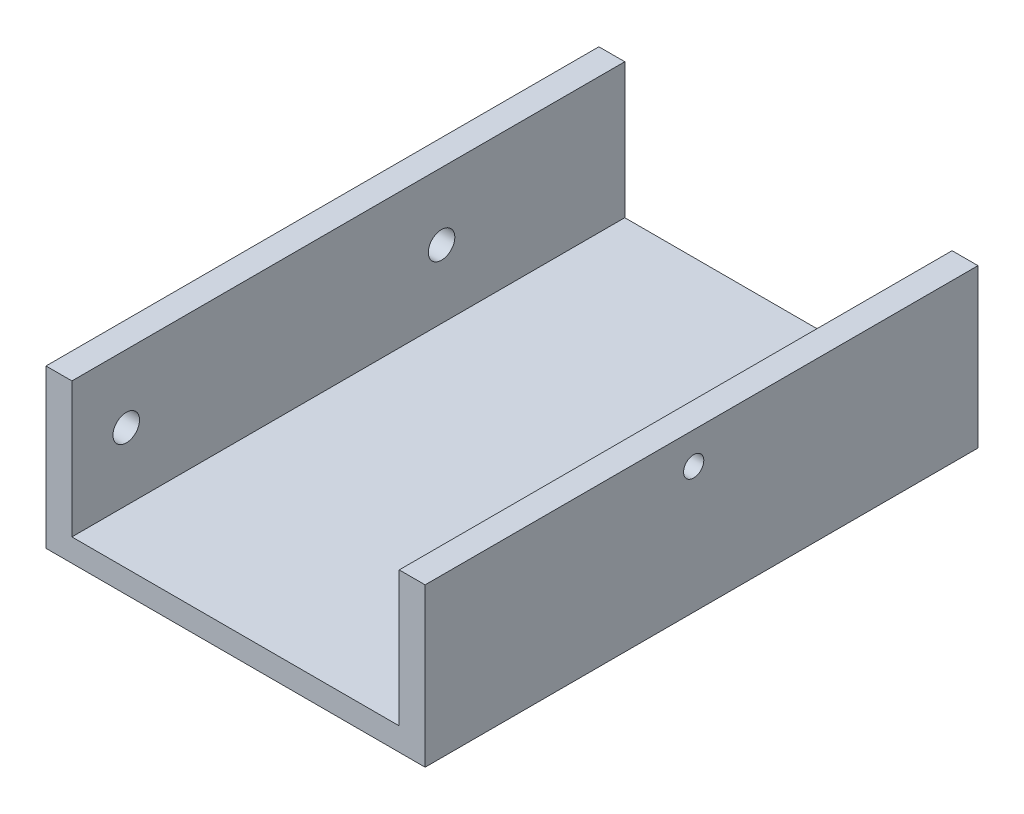
ISO-10303-21;
HEADER;
FILE_DESCRIPTION(('STEP AP214'),'2;1');
FILE_NAME('part.step','',(''),(''),'','','');
FILE_SCHEMA(('AUTOMOTIVE_DESIGN { 1 0 10303 214 1 1 1 1 }'));
ENDSEC;
DATA;
#1=APPLICATION_CONTEXT('core data for automotive mechanical design processes');
#2=APPLICATION_PROTOCOL_DEFINITION('international standard','automotive_design',2000,#1);
#3=PRODUCT_CONTEXT('',#1,'mechanical');
#4=PRODUCT('Part','Part','',(#3));
#5=PRODUCT_RELATED_PRODUCT_CATEGORY('part','',(#4));
#6=PRODUCT_DEFINITION_FORMATION('','',#4);
#7=PRODUCT_DEFINITION_CONTEXT('part definition',#1,'design');
#8=PRODUCT_DEFINITION('design','',#6,#7);
#9=PRODUCT_DEFINITION_SHAPE('','',#8);
#10=(LENGTH_UNIT() NAMED_UNIT(*) SI_UNIT(.MILLI.,.METRE.));
#11=(NAMED_UNIT(*) PLANE_ANGLE_UNIT() SI_UNIT($,.RADIAN.));
#12=(NAMED_UNIT(*) SI_UNIT($,.STERADIAN.) SOLID_ANGLE_UNIT());
#13=UNCERTAINTY_MEASURE_WITH_UNIT(LENGTH_MEASURE(1.E-05),#10,'distance_accuracy_value','');
#14=(GEOMETRIC_REPRESENTATION_CONTEXT(3) GLOBAL_UNCERTAINTY_ASSIGNED_CONTEXT((#13)) GLOBAL_UNIT_ASSIGNED_CONTEXT((#10,
#11,#12)) REPRESENTATION_CONTEXT('',''));
#15=CARTESIAN_POINT('',(0.,0.,0.));
#16=DIRECTION('',(0.,0.,1.));
#17=DIRECTION('',(1.,0.,0.));
#18=AXIS2_PLACEMENT_3D('',#15,#16,#17);
#19=CARTESIAN_POINT('',(-38.1,0.,111.125));
#20=DIRECTION('',(1.,0.,0.));
#21=DIRECTION('',(0.,0.,-1.));
#22=AXIS2_PLACEMENT_3D('',#19,#20,#21);
#23=PLANE('',#22);
#24=CARTESIAN_POINT('',(-38.1,18.1633908346726,100.203));
#25=DIRECTION('',(1.,0.,0.));
#26=DIRECTION('',(0.,0.,-1.));
#27=AXIS2_PLACEMENT_3D('',#24,#25,#26);
#28=CIRCLE('',#27,2.667);
#29=CARTESIAN_POINT('',(-38.1,18.1633908346726,97.536));
#30=VERTEX_POINT('',#29);
#31=EDGE_CURVE('E181',#30,#30,#28,.T.);
#32=ORIENTED_EDGE('',*,*,#31,.T.);
#33=EDGE_LOOP('',(#32));
#34=FACE_BOUND('',#33,.T.);
#35=CARTESIAN_POINT('',(-38.1,18.288,36.83));
#36=DIRECTION('',(1.,0.,0.));
#37=DIRECTION('',(0.,0.,-1.));
#38=AXIS2_PLACEMENT_3D('',#35,#36,#37);
#39=CIRCLE('',#38,2.667);
#40=CARTESIAN_POINT('',(-38.1,18.288,34.163));
#41=VERTEX_POINT('',#40);
#42=EDGE_CURVE('E134',#41,#41,#39,.T.);
#43=ORIENTED_EDGE('',*,*,#42,.T.);
#44=EDGE_LOOP('',(#43));
#45=FACE_BOUND('',#44,.T.);
#46=DIRECTION('',(0.,-1.,0.));
#47=VECTOR('',#46,1.);
#48=CARTESIAN_POINT('',(-38.1,0.,0.));
#49=LINE('',#48,#47);
#50=CARTESIAN_POINT('',(-38.1,31.75,0.));
#51=VERTEX_POINT('',#50);
#52=CARTESIAN_POINT('',(-38.1,0.,0.));
#53=VERTEX_POINT('',#52);
#54=EDGE_CURVE('E130',#51,#53,#49,.T.);
#55=ORIENTED_EDGE('',*,*,#54,.T.);
#56=DIRECTION('',(0.,0.,-1.));
#57=VECTOR('',#56,1.);
#58=CARTESIAN_POINT('',(-38.1,0.,111.125));
#59=LINE('',#58,#57);
#60=CARTESIAN_POINT('',(-38.1,0.,111.125));
#61=VERTEX_POINT('',#60);
#62=EDGE_CURVE('E11',#61,#53,#59,.T.);
#63=ORIENTED_EDGE('',*,*,#62,.F.);
#64=DIRECTION('',(0.,-1.,0.));
#65=VECTOR('',#64,1.);
#66=CARTESIAN_POINT('',(-38.1,0.,111.125));
#67=LINE('',#66,#65);
#68=CARTESIAN_POINT('',(-38.1,31.75,111.125));
#69=VERTEX_POINT('',#68);
#70=EDGE_CURVE('E145',#69,#61,#67,.T.);
#71=ORIENTED_EDGE('',*,*,#70,.F.);
#72=DIRECTION('',(0.,0.,-1.));
#73=VECTOR('',#72,1.);
#74=CARTESIAN_POINT('',(-38.1,31.75,111.125));
#75=LINE('',#74,#73);
#76=EDGE_CURVE('E126',#69,#51,#75,.T.);
#77=ORIENTED_EDGE('',*,*,#76,.T.);
#78=EDGE_LOOP('',(#55,#63,#71,#77));
#79=FACE_BOUND('',#78,.T.);
#80=ADVANCED_FACE('F34',(#34,#45,#79),#23,.F.);
#81=CARTESIAN_POINT('',(-38.1,0.,111.125));
#82=DIRECTION('',(0.,1.,0.));
#83=DIRECTION('',(-1.,0.,0.));
#84=AXIS2_PLACEMENT_3D('',#81,#82,#83);
#85=PLANE('',#84);
#86=DIRECTION('',(1.,0.,0.));
#87=VECTOR('',#86,1.);
#88=CARTESIAN_POINT('',(-38.1,0.,0.));
#89=LINE('',#88,#87);
#90=CARTESIAN_POINT('',(38.1,0.,0.));
#91=VERTEX_POINT('',#90);
#92=EDGE_CURVE('E133',#53,#91,#89,.T.);
#93=ORIENTED_EDGE('',*,*,#92,.T.);
#94=DIRECTION('',(0.,0.,-1.));
#95=VECTOR('',#94,1.);
#96=CARTESIAN_POINT('',(38.1,0.,111.125));
#97=LINE('',#96,#95);
#98=CARTESIAN_POINT('',(38.1,0.,111.125));
#99=VERTEX_POINT('',#98);
#100=EDGE_CURVE('E42',#99,#91,#97,.T.);
#101=ORIENTED_EDGE('',*,*,#100,.F.);
#102=DIRECTION('',(1.,0.,0.));
#103=VECTOR('',#102,1.);
#104=CARTESIAN_POINT('',(-38.1,0.,111.125));
#105=LINE('',#104,#103);
#106=EDGE_CURVE('E93',#61,#99,#105,.T.);
#107=ORIENTED_EDGE('',*,*,#106,.F.);
#108=ORIENTED_EDGE('',*,*,#62,.T.);
#109=EDGE_LOOP('',(#93,#101,#107,#108));
#110=FACE_BOUND('',#109,.T.);
#111=ADVANCED_FACE('F215',(#110),#85,.F.);
#112=CARTESIAN_POINT('',(38.1,31.75,111.125));
#113=DIRECTION('',(-1.,0.,0.));
#114=DIRECTION('',(0.,-1.,0.));
#115=AXIS2_PLACEMENT_3D('',#112,#113,#114);
#116=PLANE('',#115);
#117=CARTESIAN_POINT('',(38.1,25.4,57.15));
#118=DIRECTION('',(-1.,0.,0.));
#119=DIRECTION('',(0.,0.,1.));
#120=AXIS2_PLACEMENT_3D('',#117,#118,#119);
#121=CIRCLE('',#120,2.032);
#122=CARTESIAN_POINT('',(38.1,25.4,59.182));
#123=VERTEX_POINT('',#122);
#124=EDGE_CURVE('E187',#123,#123,#121,.T.);
#125=ORIENTED_EDGE('',*,*,#124,.T.);
#126=EDGE_LOOP('',(#125));
#127=FACE_BOUND('',#126,.T.);
#128=DIRECTION('',(0.,1.,0.));
#129=VECTOR('',#128,1.);
#130=CARTESIAN_POINT('',(38.1,31.75,0.));
#131=LINE('',#130,#129);
#132=CARTESIAN_POINT('',(38.1,31.75,0.));
#133=VERTEX_POINT('',#132);
#134=EDGE_CURVE('E136',#91,#133,#131,.T.);
#135=ORIENTED_EDGE('',*,*,#134,.T.);
#136=DIRECTION('',(0.,0.,-1.));
#137=VECTOR('',#136,1.);
#138=CARTESIAN_POINT('',(38.1,31.75,111.125));
#139=LINE('',#138,#137);
#140=CARTESIAN_POINT('',(38.1,31.75,111.125));
#141=VERTEX_POINT('',#140);
#142=EDGE_CURVE('E152',#141,#133,#139,.T.);
#143=ORIENTED_EDGE('',*,*,#142,.F.);
#144=DIRECTION('',(0.,1.,0.));
#145=VECTOR('',#144,1.);
#146=CARTESIAN_POINT('',(38.1,31.75,111.125));
#147=LINE('',#146,#145);
#148=EDGE_CURVE('E160',#99,#141,#147,.T.);
#149=ORIENTED_EDGE('',*,*,#148,.F.);
#150=ORIENTED_EDGE('',*,*,#100,.T.);
#151=EDGE_LOOP('',(#135,#143,#149,#150));
#152=FACE_BOUND('',#151,.T.);
#153=ADVANCED_FACE('F158',(#127,#152),#116,.F.);
#154=CARTESIAN_POINT('',(32.893,31.75,111.125));
#155=DIRECTION('',(0.,-1.,0.));
#156=DIRECTION('',(0.,0.,-1.));
#157=AXIS2_PLACEMENT_3D('',#154,#155,#156);
#158=PLANE('',#157);
#159=DIRECTION('',(-1.,0.,0.));
#160=VECTOR('',#159,1.);
#161=CARTESIAN_POINT('',(32.893,31.75,0.));
#162=LINE('',#161,#160);
#163=CARTESIAN_POINT('',(32.893,31.75,0.));
#164=VERTEX_POINT('',#163);
#165=EDGE_CURVE('E138',#133,#164,#162,.T.);
#166=ORIENTED_EDGE('',*,*,#165,.T.);
#167=DIRECTION('',(0.,0.,-1.));
#168=VECTOR('',#167,1.);
#169=CARTESIAN_POINT('',(32.893,31.75,111.125));
#170=LINE('',#169,#168);
#171=CARTESIAN_POINT('',(32.893,31.75,111.125));
#172=VERTEX_POINT('',#171);
#173=EDGE_CURVE('E149',#172,#164,#170,.T.);
#174=ORIENTED_EDGE('',*,*,#173,.F.);
#175=DIRECTION('',(-1.,0.,0.));
#176=VECTOR('',#175,1.);
#177=CARTESIAN_POINT('',(32.893,31.75,111.125));
#178=LINE('',#177,#176);
#179=EDGE_CURVE('E172',#141,#172,#178,.T.);
#180=ORIENTED_EDGE('',*,*,#179,.F.);
#181=ORIENTED_EDGE('',*,*,#142,.T.);
#182=EDGE_LOOP('',(#166,#174,#180,#181));
#183=FACE_BOUND('',#182,.T.);
#184=ADVANCED_FACE('F168',(#183),#158,.F.);
#185=CARTESIAN_POINT('',(32.893,4.5974,111.125));
#186=DIRECTION('',(1.,0.,0.));
#187=DIRECTION('',(0.,0.,-1.));
#188=AXIS2_PLACEMENT_3D('',#185,#186,#187);
#189=PLANE('',#188);
#190=CARTESIAN_POINT('',(32.893,25.4,57.15));
#191=DIRECTION('',(-1.,0.,0.));
#192=DIRECTION('',(0.,0.,1.));
#193=AXIS2_PLACEMENT_3D('',#190,#191,#192);
#194=CIRCLE('',#193,2.032);
#195=CARTESIAN_POINT('',(32.893,25.4,59.182));
#196=VERTEX_POINT('',#195);
#197=EDGE_CURVE('E190',#196,#196,#194,.T.);
#198=ORIENTED_EDGE('',*,*,#197,.F.);
#199=EDGE_LOOP('',(#198));
#200=FACE_BOUND('',#199,.T.);
#201=DIRECTION('',(0.,-1.,0.));
#202=VECTOR('',#201,1.);
#203=CARTESIAN_POINT('',(32.893,4.5974,0.));
#204=LINE('',#203,#202);
#205=CARTESIAN_POINT('',(32.893,4.5974,0.));
#206=VERTEX_POINT('',#205);
#207=EDGE_CURVE('E140',#164,#206,#204,.T.);
#208=ORIENTED_EDGE('',*,*,#207,.T.);
#209=DIRECTION('',(0.,0.,-1.));
#210=VECTOR('',#209,1.);
#211=CARTESIAN_POINT('',(32.893,4.5974,111.125));
#212=LINE('',#211,#210);
#213=CARTESIAN_POINT('',(32.893,4.5974,111.125));
#214=VERTEX_POINT('',#213);
#215=EDGE_CURVE('E121',#214,#206,#212,.T.);
#216=ORIENTED_EDGE('',*,*,#215,.F.);
#217=DIRECTION('',(0.,-1.,0.));
#218=VECTOR('',#217,1.);
#219=CARTESIAN_POINT('',(32.893,4.5974,111.125));
#220=LINE('',#219,#218);
#221=EDGE_CURVE('E112',#172,#214,#220,.T.);
#222=ORIENTED_EDGE('',*,*,#221,.F.);
#223=ORIENTED_EDGE('',*,*,#173,.T.);
#224=EDGE_LOOP('',(#208,#216,#222,#223));
#225=FACE_BOUND('',#224,.T.);
#226=ADVANCED_FACE('F171',(#200,#225),#189,.F.);
#227=CARTESIAN_POINT('',(-32.893,4.5974,111.125));
#228=DIRECTION('',(0.,-1.,0.));
#229=DIRECTION('',(0.,0.,-1.));
#230=AXIS2_PLACEMENT_3D('',#227,#228,#229);
#231=PLANE('',#230);
#232=DIRECTION('',(-1.,0.,0.));
#233=VECTOR('',#232,1.);
#234=CARTESIAN_POINT('',(-32.893,4.5974,0.));
#235=LINE('',#234,#233);
#236=CARTESIAN_POINT('',(-32.893,4.5974,0.));
#237=VERTEX_POINT('',#236);
#238=EDGE_CURVE('E120',#206,#237,#235,.T.);
#239=ORIENTED_EDGE('',*,*,#238,.T.);
#240=DIRECTION('',(0.,0.,-1.));
#241=VECTOR('',#240,1.);
#242=CARTESIAN_POINT('',(-32.893,4.5974,111.125));
#243=LINE('',#242,#241);
#244=CARTESIAN_POINT('',(-32.893,4.5974,111.125));
#245=VERTEX_POINT('',#244);
#246=EDGE_CURVE('E117',#245,#237,#243,.T.);
#247=ORIENTED_EDGE('',*,*,#246,.F.);
#248=DIRECTION('',(-1.,0.,0.));
#249=VECTOR('',#248,1.);
#250=CARTESIAN_POINT('',(-32.893,4.5974,111.125));
#251=LINE('',#250,#249);
#252=EDGE_CURVE('E106',#214,#245,#251,.T.);
#253=ORIENTED_EDGE('',*,*,#252,.F.);
#254=ORIENTED_EDGE('',*,*,#215,.T.);
#255=EDGE_LOOP('',(#239,#247,#253,#254));
#256=FACE_BOUND('',#255,.T.);
#257=ADVANCED_FACE('F118',(#256),#231,.F.);
#258=CARTESIAN_POINT('',(-32.893,31.75,111.125));
#259=DIRECTION('',(-1.,0.,0.));
#260=DIRECTION('',(0.,0.,1.));
#261=AXIS2_PLACEMENT_3D('',#258,#259,#260);
#262=PLANE('',#261);
#263=CARTESIAN_POINT('',(-32.893,18.1633908346726,100.203));
#264=DIRECTION('',(1.,0.,0.));
#265=DIRECTION('',(0.,0.,-1.));
#266=AXIS2_PLACEMENT_3D('',#263,#264,#265);
#267=CIRCLE('',#266,2.667);
#268=CARTESIAN_POINT('',(-32.893,18.1633908346726,97.536));
#269=VERTEX_POINT('',#268);
#270=EDGE_CURVE('E184',#269,#269,#267,.T.);
#271=ORIENTED_EDGE('',*,*,#270,.F.);
#272=EDGE_LOOP('',(#271));
#273=FACE_BOUND('',#272,.T.);
#274=CARTESIAN_POINT('',(-32.893,18.288,36.83));
#275=DIRECTION('',(1.,0.,0.));
#276=DIRECTION('',(0.,0.,-1.));
#277=AXIS2_PLACEMENT_3D('',#274,#275,#276);
#278=CIRCLE('',#277,2.667);
#279=CARTESIAN_POINT('',(-32.893,18.288,34.163));
#280=VERTEX_POINT('',#279);
#281=EDGE_CURVE('E178',#280,#280,#278,.T.);
#282=ORIENTED_EDGE('',*,*,#281,.F.);
#283=EDGE_LOOP('',(#282));
#284=FACE_BOUND('',#283,.T.);
#285=DIRECTION('',(0.,1.,0.));
#286=VECTOR('',#285,1.);
#287=CARTESIAN_POINT('',(-32.893,31.75,0.));
#288=LINE('',#287,#286);
#289=CARTESIAN_POINT('',(-32.893,31.75,0.));
#290=VERTEX_POINT('',#289);
#291=EDGE_CURVE('E79',#237,#290,#288,.T.);
#292=ORIENTED_EDGE('',*,*,#291,.T.);
#293=DIRECTION('',(0.,0.,-1.));
#294=VECTOR('',#293,1.);
#295=CARTESIAN_POINT('',(-32.893,31.75,111.125));
#296=LINE('',#295,#294);
#297=CARTESIAN_POINT('',(-32.893,31.75,111.125));
#298=VERTEX_POINT('',#297);
#299=EDGE_CURVE('E122',#298,#290,#296,.T.);
#300=ORIENTED_EDGE('',*,*,#299,.F.);
#301=DIRECTION('',(0.,1.,0.));
#302=VECTOR('',#301,1.);
#303=CARTESIAN_POINT('',(-32.893,31.75,111.125));
#304=LINE('',#303,#302);
#305=EDGE_CURVE('E110',#245,#298,#304,.T.);
#306=ORIENTED_EDGE('',*,*,#305,.F.);
#307=ORIENTED_EDGE('',*,*,#246,.T.);
#308=EDGE_LOOP('',(#292,#300,#306,#307));
#309=FACE_BOUND('',#308,.T.);
#310=ADVANCED_FACE('F124',(#273,#284,#309),#262,.F.);
#311=CARTESIAN_POINT('',(-38.1,31.75,111.125));
#312=DIRECTION('',(0.,-1.,0.));
#313=DIRECTION('',(0.,0.,-1.));
#314=AXIS2_PLACEMENT_3D('',#311,#312,#313);
#315=PLANE('',#314);
#316=DIRECTION('',(-1.,0.,0.));
#317=VECTOR('',#316,1.);
#318=CARTESIAN_POINT('',(-38.1,31.75,0.));
#319=LINE('',#318,#317);
#320=EDGE_CURVE('E85',#290,#51,#319,.T.);
#321=ORIENTED_EDGE('',*,*,#320,.T.);
#322=ORIENTED_EDGE('',*,*,#76,.F.);
#323=DIRECTION('',(-1.,0.,0.));
#324=VECTOR('',#323,1.);
#325=CARTESIAN_POINT('',(-38.1,31.75,111.125));
#326=LINE('',#325,#324);
#327=EDGE_CURVE('E50',#298,#69,#326,.T.);
#328=ORIENTED_EDGE('',*,*,#327,.F.);
#329=ORIENTED_EDGE('',*,*,#299,.T.);
#330=EDGE_LOOP('',(#321,#322,#328,#329));
#331=FACE_BOUND('',#330,.T.);
#332=ADVANCED_FACE('F226',(#331),#315,.F.);
#333=CARTESIAN_POINT('',(0.,0.,111.125));
#334=DIRECTION('',(0.,0.,-1.));
#335=DIRECTION('',(-1.,0.,0.));
#336=AXIS2_PLACEMENT_3D('',#333,#334,#335);
#337=PLANE('',#336);
#338=ORIENTED_EDGE('',*,*,#70,.T.);
#339=ORIENTED_EDGE('',*,*,#106,.T.);
#340=ORIENTED_EDGE('',*,*,#148,.T.);
#341=ORIENTED_EDGE('',*,*,#179,.T.);
#342=ORIENTED_EDGE('',*,*,#221,.T.);
#343=ORIENTED_EDGE('',*,*,#252,.T.);
#344=ORIENTED_EDGE('',*,*,#305,.T.);
#345=ORIENTED_EDGE('',*,*,#327,.T.);
#346=EDGE_LOOP('',(#338,#339,#340,#341,#342,#343,#344,#345));
#347=FACE_BOUND('',#346,.T.);
#348=ADVANCED_FACE('F108',(#347),#337,.F.);
#349=CARTESIAN_POINT('',(0.,0.,0.));
#350=DIRECTION('',(0.,0.,-1.));
#351=DIRECTION('',(-1.,0.,0.));
#352=AXIS2_PLACEMENT_3D('',#349,#350,#351);
#353=PLANE('',#352);
#354=ORIENTED_EDGE('',*,*,#54,.F.);
#355=ORIENTED_EDGE('',*,*,#320,.F.);
#356=ORIENTED_EDGE('',*,*,#291,.F.);
#357=ORIENTED_EDGE('',*,*,#238,.F.);
#358=ORIENTED_EDGE('',*,*,#207,.F.);
#359=ORIENTED_EDGE('',*,*,#165,.F.);
#360=ORIENTED_EDGE('',*,*,#134,.F.);
#361=ORIENTED_EDGE('',*,*,#92,.F.);
#362=EDGE_LOOP('',(#354,#355,#356,#357,#358,#359,#360,#361));
#363=FACE_BOUND('',#362,.T.);
#364=ADVANCED_FACE('F164',(#363),#353,.T.);
#365=CARTESIAN_POINT('',(-38.1,18.288,36.83));
#366=DIRECTION('',(1.,0.,0.));
#367=DIRECTION('',(0.,0.,-1.));
#368=AXIS2_PLACEMENT_3D('',#365,#366,#367);
#369=CYLINDRICAL_SURFACE('',#368,2.667);
#370=ORIENTED_EDGE('',*,*,#42,.F.);
#371=EDGE_LOOP('',(#370));
#372=FACE_BOUND('',#371,.T.);
#373=ORIENTED_EDGE('',*,*,#281,.T.);
#374=EDGE_LOOP('',(#373));
#375=FACE_BOUND('',#374,.T.);
#376=ADVANCED_FACE('F238',(#372,#375),#369,.F.);
#377=CARTESIAN_POINT('',(-38.1,18.1633908346726,100.203));
#378=DIRECTION('',(1.,0.,0.));
#379=DIRECTION('',(0.,0.,-1.));
#380=AXIS2_PLACEMENT_3D('',#377,#378,#379);
#381=CYLINDRICAL_SURFACE('',#380,2.667);
#382=ORIENTED_EDGE('',*,*,#31,.F.);
#383=EDGE_LOOP('',(#382));
#384=FACE_BOUND('',#383,.T.);
#385=ORIENTED_EDGE('',*,*,#270,.T.);
#386=EDGE_LOOP('',(#385));
#387=FACE_BOUND('',#386,.T.);
#388=ADVANCED_FACE('F200',(#384,#387),#381,.F.);
#389=CARTESIAN_POINT('',(38.1,25.4,57.15));
#390=DIRECTION('',(-1.,0.,0.));
#391=DIRECTION('',(0.,0.,1.));
#392=AXIS2_PLACEMENT_3D('',#389,#390,#391);
#393=CYLINDRICAL_SURFACE('',#392,2.032);
#394=ORIENTED_EDGE('',*,*,#124,.F.);
#395=EDGE_LOOP('',(#394));
#396=FACE_BOUND('',#395,.T.);
#397=ORIENTED_EDGE('',*,*,#197,.T.);
#398=EDGE_LOOP('',(#397));
#399=FACE_BOUND('',#398,.T.);
#400=ADVANCED_FACE('F197',(#396,#399),#393,.F.);
#401=CLOSED_SHELL('',(#80,#111,#153,#184,#226,#257,#310,#332,#348,#364,#376,#388,#400));
#402=MANIFOLD_SOLID_BREP('B2',#401);
#403=ADVANCED_BREP_SHAPE_REPRESENTATION('',(#18,#402),#14);
#404=SHAPE_DEFINITION_REPRESENTATION(#9,#403);
ENDSEC;
END-ISO-10303-21;
